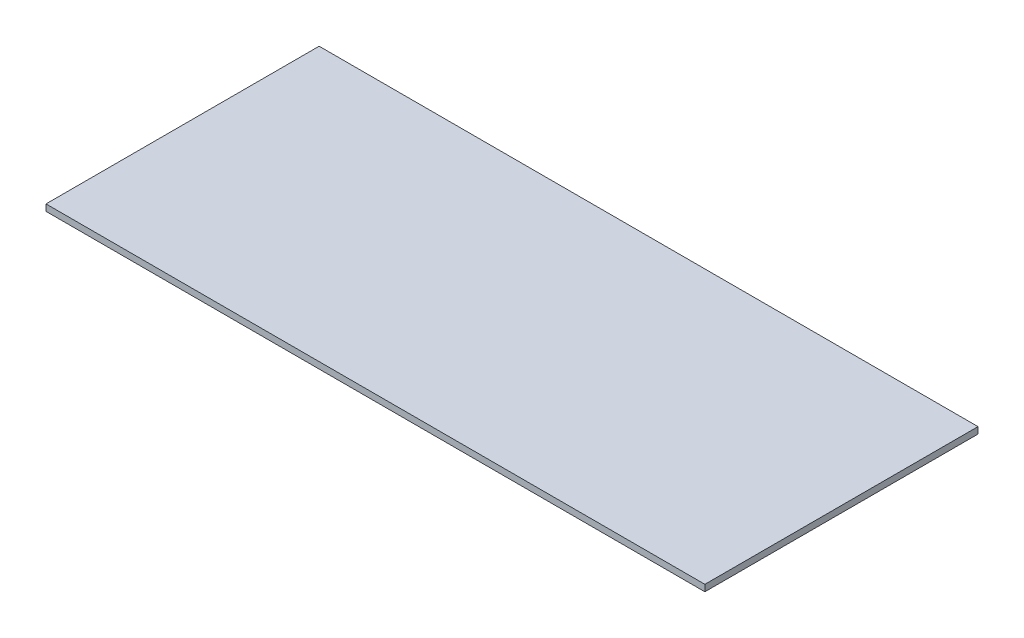
ISO-10303-21;
HEADER;
FILE_DESCRIPTION(('STEP AP214'),'2;1');
FILE_NAME('part.step','',(''),(''),'','','');
FILE_SCHEMA(('AUTOMOTIVE_DESIGN { 1 0 10303 214 1 1 1 1 }'));
ENDSEC;
DATA;
#1=APPLICATION_CONTEXT('core data for automotive mechanical design processes');
#2=APPLICATION_PROTOCOL_DEFINITION('international standard','automotive_design',2000,#1);
#3=PRODUCT_CONTEXT('',#1,'mechanical');
#4=PRODUCT('Part','Part','',(#3));
#5=PRODUCT_RELATED_PRODUCT_CATEGORY('part','',(#4));
#6=PRODUCT_DEFINITION_FORMATION('','',#4);
#7=PRODUCT_DEFINITION_CONTEXT('part definition',#1,'design');
#8=PRODUCT_DEFINITION('design','',#6,#7);
#9=PRODUCT_DEFINITION_SHAPE('','',#8);
#10=(LENGTH_UNIT() NAMED_UNIT(*) SI_UNIT(.MILLI.,.METRE.));
#11=(NAMED_UNIT(*) PLANE_ANGLE_UNIT() SI_UNIT($,.RADIAN.));
#12=(NAMED_UNIT(*) SI_UNIT($,.STERADIAN.) SOLID_ANGLE_UNIT());
#13=UNCERTAINTY_MEASURE_WITH_UNIT(LENGTH_MEASURE(1.E-05),#10,'distance_accuracy_value','');
#14=(GEOMETRIC_REPRESENTATION_CONTEXT(3) GLOBAL_UNCERTAINTY_ASSIGNED_CONTEXT((#13)) GLOBAL_UNIT_ASSIGNED_CONTEXT((#10,
#11,#12)) REPRESENTATION_CONTEXT('',''));
#15=CARTESIAN_POINT('',(0.,0.,0.));
#16=DIRECTION('',(0.,0.,1.));
#17=DIRECTION('',(1.,0.,0.));
#18=AXIS2_PLACEMENT_3D('',#15,#16,#17);
#19=CARTESIAN_POINT('',(0.,12.7,0.));
#20=DIRECTION('',(1.,0.,0.));
#21=DIRECTION('',(0.,0.,-1.));
#22=AXIS2_PLACEMENT_3D('',#19,#20,#21);
#23=PLANE('',#22);
#24=DIRECTION('',(0.,0.,1.));
#25=VECTOR('',#24,1.);
#26=CARTESIAN_POINT('',(0.,0.,0.));
#27=LINE('',#26,#25);
#28=CARTESIAN_POINT('',(0.,0.,-534.6));
#29=VERTEX_POINT('',#28);
#30=CARTESIAN_POINT('',(0.,0.,0.));
#31=VERTEX_POINT('',#30);
#32=EDGE_CURVE('E96',#29,#31,#27,.T.);
#33=ORIENTED_EDGE('',*,*,#32,.T.);
#34=DIRECTION('',(0.,-1.,0.));
#35=VECTOR('',#34,1.);
#36=CARTESIAN_POINT('',(0.,12.7,0.));
#37=LINE('',#36,#35);
#38=CARTESIAN_POINT('',(0.,12.7,0.));
#39=VERTEX_POINT('',#38);
#40=EDGE_CURVE('E11',#39,#31,#37,.T.);
#41=ORIENTED_EDGE('',*,*,#40,.F.);
#42=DIRECTION('',(0.,0.,1.));
#43=VECTOR('',#42,1.);
#44=CARTESIAN_POINT('',(0.,12.7,0.));
#45=LINE('',#44,#43);
#46=CARTESIAN_POINT('',(0.,12.7,-534.6));
#47=VERTEX_POINT('',#46);
#48=EDGE_CURVE('E84',#47,#39,#45,.T.);
#49=ORIENTED_EDGE('',*,*,#48,.F.);
#50=DIRECTION('',(0.,-1.,0.));
#51=VECTOR('',#50,1.);
#52=CARTESIAN_POINT('',(0.,12.7,-534.6));
#53=LINE('',#52,#51);
#54=EDGE_CURVE('E92',#47,#29,#53,.T.);
#55=ORIENTED_EDGE('',*,*,#54,.T.);
#56=EDGE_LOOP('',(#33,#41,#49,#55));
#57=FACE_BOUND('',#56,.T.);
#58=ADVANCED_FACE('F33',(#57),#23,.F.);
#59=CARTESIAN_POINT('',(0.,12.7,0.));
#60=DIRECTION('',(0.,0.,-1.));
#61=DIRECTION('',(-1.,0.,0.));
#62=AXIS2_PLACEMENT_3D('',#59,#60,#61);
#63=PLANE('',#62);
#64=DIRECTION('',(1.,0.,0.));
#65=VECTOR('',#64,1.);
#66=CARTESIAN_POINT('',(0.,0.,0.));
#67=LINE('',#66,#65);
#68=CARTESIAN_POINT('',(1289.6,0.,0.));
#69=VERTEX_POINT('',#68);
#70=EDGE_CURVE('E88',#31,#69,#67,.T.);
#71=ORIENTED_EDGE('',*,*,#70,.T.);
#72=DIRECTION('',(0.,-1.,0.));
#73=VECTOR('',#72,1.);
#74=CARTESIAN_POINT('',(1289.6,12.7,0.));
#75=LINE('',#74,#73);
#76=CARTESIAN_POINT('',(1289.6,12.7,0.));
#77=VERTEX_POINT('',#76);
#78=EDGE_CURVE('E41',#77,#69,#75,.T.);
#79=ORIENTED_EDGE('',*,*,#78,.F.);
#80=DIRECTION('',(1.,0.,0.));
#81=VECTOR('',#80,1.);
#82=CARTESIAN_POINT('',(0.,12.7,0.));
#83=LINE('',#82,#81);
#84=EDGE_CURVE('E79',#39,#77,#83,.T.);
#85=ORIENTED_EDGE('',*,*,#84,.F.);
#86=ORIENTED_EDGE('',*,*,#40,.T.);
#87=EDGE_LOOP('',(#71,#79,#85,#86));
#88=FACE_BOUND('',#87,.T.);
#89=ADVANCED_FACE('F87',(#88),#63,.F.);
#90=CARTESIAN_POINT('',(1289.6,12.7,0.));
#91=DIRECTION('',(-1.,0.,0.));
#92=DIRECTION('',(0.,0.,1.));
#93=AXIS2_PLACEMENT_3D('',#90,#91,#92);
#94=PLANE('',#93);
#95=DIRECTION('',(0.,0.,-1.));
#96=VECTOR('',#95,1.);
#97=CARTESIAN_POINT('',(1289.6,0.,0.));
#98=LINE('',#97,#96);
#99=CARTESIAN_POINT('',(1289.6,0.,-534.6));
#100=VERTEX_POINT('',#99);
#101=EDGE_CURVE('E66',#69,#100,#98,.T.);
#102=ORIENTED_EDGE('',*,*,#101,.T.);
#103=DIRECTION('',(0.,-1.,0.));
#104=VECTOR('',#103,1.);
#105=CARTESIAN_POINT('',(1289.6,12.7,-534.6));
#106=LINE('',#105,#104);
#107=CARTESIAN_POINT('',(1289.6,12.7,-534.6));
#108=VERTEX_POINT('',#107);
#109=EDGE_CURVE('E89',#108,#100,#106,.T.);
#110=ORIENTED_EDGE('',*,*,#109,.F.);
#111=DIRECTION('',(0.,0.,-1.));
#112=VECTOR('',#111,1.);
#113=CARTESIAN_POINT('',(1289.6,12.7,0.));
#114=LINE('',#113,#112);
#115=EDGE_CURVE('E82',#77,#108,#114,.T.);
#116=ORIENTED_EDGE('',*,*,#115,.F.);
#117=ORIENTED_EDGE('',*,*,#78,.T.);
#118=EDGE_LOOP('',(#102,#110,#116,#117));
#119=FACE_BOUND('',#118,.T.);
#120=ADVANCED_FACE('F90',(#119),#94,.F.);
#121=CARTESIAN_POINT('',(0.,12.7,-534.6));
#122=DIRECTION('',(0.,0.,1.));
#123=DIRECTION('',(1.,0.,0.));
#124=AXIS2_PLACEMENT_3D('',#121,#122,#123);
#125=PLANE('',#124);
#126=DIRECTION('',(-1.,0.,0.));
#127=VECTOR('',#126,1.);
#128=CARTESIAN_POINT('',(0.,0.,-534.6));
#129=LINE('',#128,#127);
#130=EDGE_CURVE('E72',#100,#29,#129,.T.);
#131=ORIENTED_EDGE('',*,*,#130,.T.);
#132=ORIENTED_EDGE('',*,*,#54,.F.);
#133=DIRECTION('',(-1.,0.,0.));
#134=VECTOR('',#133,1.);
#135=CARTESIAN_POINT('',(0.,12.7,-534.6));
#136=LINE('',#135,#134);
#137=EDGE_CURVE('E49',#108,#47,#136,.T.);
#138=ORIENTED_EDGE('',*,*,#137,.F.);
#139=ORIENTED_EDGE('',*,*,#109,.T.);
#140=EDGE_LOOP('',(#131,#132,#138,#139));
#141=FACE_BOUND('',#140,.T.);
#142=ADVANCED_FACE('F103',(#141),#125,.F.);
#143=CARTESIAN_POINT('',(0.,12.7,0.));
#144=DIRECTION('',(0.,-1.,0.));
#145=DIRECTION('',(0.,0.,-1.));
#146=AXIS2_PLACEMENT_3D('',#143,#144,#145);
#147=PLANE('',#146);
#148=ORIENTED_EDGE('',*,*,#48,.T.);
#149=ORIENTED_EDGE('',*,*,#84,.T.);
#150=ORIENTED_EDGE('',*,*,#115,.T.);
#151=ORIENTED_EDGE('',*,*,#137,.T.);
#152=EDGE_LOOP('',(#148,#149,#150,#151));
#153=FACE_BOUND('',#152,.T.);
#154=ADVANCED_FACE('F80',(#153),#147,.F.);
#155=CARTESIAN_POINT('',(0.,0.,0.));
#156=DIRECTION('',(0.,-1.,0.));
#157=DIRECTION('',(0.,0.,-1.));
#158=AXIS2_PLACEMENT_3D('',#155,#156,#157);
#159=PLANE('',#158);
#160=ORIENTED_EDGE('',*,*,#32,.F.);
#161=ORIENTED_EDGE('',*,*,#130,.F.);
#162=ORIENTED_EDGE('',*,*,#101,.F.);
#163=ORIENTED_EDGE('',*,*,#70,.F.);
#164=EDGE_LOOP('',(#160,#161,#162,#163));
#165=FACE_BOUND('',#164,.T.);
#166=ADVANCED_FACE('F106',(#165),#159,.T.);
#167=CLOSED_SHELL('',(#58,#89,#120,#142,#154,#166));
#168=MANIFOLD_SOLID_BREP('B2',#167);
#169=ADVANCED_BREP_SHAPE_REPRESENTATION('',(#18,#168),#14);
#170=SHAPE_DEFINITION_REPRESENTATION(#9,#169);
ENDSEC;
END-ISO-10303-21;
